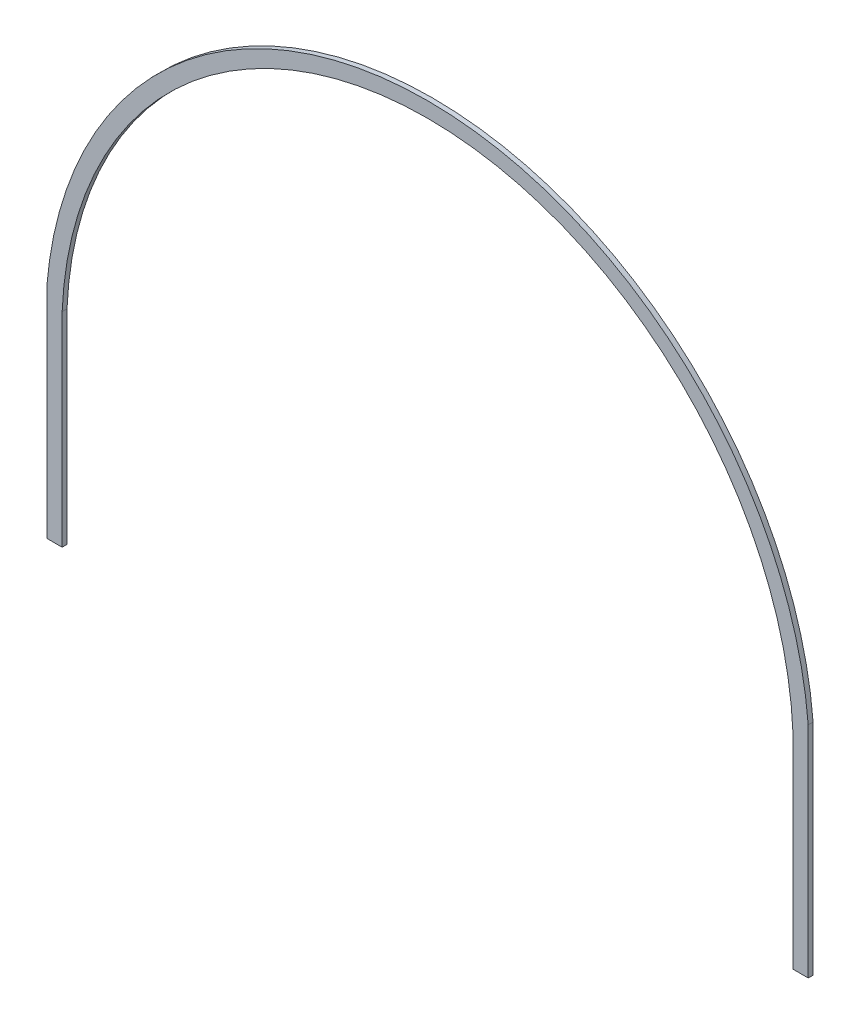
ISO-10303-21;
HEADER;
FILE_DESCRIPTION(('STEP AP214'),'2;1');
FILE_NAME('part.step','',(''),(''),'','','');
FILE_SCHEMA(('AUTOMOTIVE_DESIGN { 1 0 10303 214 1 1 1 1 }'));
ENDSEC;
DATA;
#1=APPLICATION_CONTEXT('core data for automotive mechanical design processes');
#2=APPLICATION_PROTOCOL_DEFINITION('international standard','automotive_design',2000,#1);
#3=PRODUCT_CONTEXT('',#1,'mechanical');
#4=PRODUCT('Part','Part','',(#3));
#5=PRODUCT_RELATED_PRODUCT_CATEGORY('part','',(#4));
#6=PRODUCT_DEFINITION_FORMATION('','',#4);
#7=PRODUCT_DEFINITION_CONTEXT('part definition',#1,'design');
#8=PRODUCT_DEFINITION('design','',#6,#7);
#9=PRODUCT_DEFINITION_SHAPE('','',#8);
#10=(LENGTH_UNIT() NAMED_UNIT(*) SI_UNIT(.MILLI.,.METRE.));
#11=(NAMED_UNIT(*) PLANE_ANGLE_UNIT() SI_UNIT($,.RADIAN.));
#12=(NAMED_UNIT(*) SI_UNIT($,.STERADIAN.) SOLID_ANGLE_UNIT());
#13=UNCERTAINTY_MEASURE_WITH_UNIT(LENGTH_MEASURE(1.E-05),#10,'distance_accuracy_value','');
#14=(GEOMETRIC_REPRESENTATION_CONTEXT(3) GLOBAL_UNCERTAINTY_ASSIGNED_CONTEXT((#13)) GLOBAL_UNIT_ASSIGNED_CONTEXT((#10,
#11,#12)) REPRESENTATION_CONTEXT('',''));
#15=CARTESIAN_POINT('',(0.,0.,0.));
#16=DIRECTION('',(0.,0.,1.));
#17=DIRECTION('',(1.,0.,0.));
#18=AXIS2_PLACEMENT_3D('',#15,#16,#17);
#19=CARTESIAN_POINT('',(0.,0.,1.6));
#20=DIRECTION('',(1.,0.,0.));
#21=DIRECTION('',(0.,0.,-1.));
#22=AXIS2_PLACEMENT_3D('',#19,#20,#21);
#23=PLANE('',#22);
#24=DIRECTION('',(0.,-1.,0.));
#25=VECTOR('',#24,1.);
#26=CARTESIAN_POINT('',(0.,0.,0.));
#27=LINE('',#26,#25);
#28=CARTESIAN_POINT('',(0.,72.,0.));
#29=VERTEX_POINT('',#28);
#30=CARTESIAN_POINT('',(0.,0.,0.));
#31=VERTEX_POINT('',#30);
#32=EDGE_CURVE('E142',#29,#31,#27,.T.);
#33=ORIENTED_EDGE('',*,*,#32,.T.);
#34=DIRECTION('',(0.,0.,-1.));
#35=VECTOR('',#34,1.);
#36=CARTESIAN_POINT('',(0.,0.,1.6));
#37=LINE('',#36,#35);
#38=CARTESIAN_POINT('',(0.,0.,1.6));
#39=VERTEX_POINT('',#38);
#40=EDGE_CURVE('E11',#39,#31,#37,.T.);
#41=ORIENTED_EDGE('',*,*,#40,.F.);
#42=DIRECTION('',(0.,-1.,0.));
#43=VECTOR('',#42,1.);
#44=CARTESIAN_POINT('',(0.,0.,1.6));
#45=LINE('',#44,#43);
#46=CARTESIAN_POINT('',(0.,72.,1.6));
#47=VERTEX_POINT('',#46);
#48=EDGE_CURVE('E164',#47,#39,#45,.T.);
#49=ORIENTED_EDGE('',*,*,#48,.F.);
#50=DIRECTION('',(0.,0.,-1.));
#51=VECTOR('',#50,1.);
#52=CARTESIAN_POINT('',(0.,72.,1.6));
#53=LINE('',#52,#51);
#54=EDGE_CURVE('E138',#47,#29,#53,.T.);
#55=ORIENTED_EDGE('',*,*,#54,.T.);
#56=EDGE_LOOP('',(#33,#41,#49,#55));
#57=FACE_BOUND('',#56,.T.);
#58=ADVANCED_FACE('F39',(#57),#23,.F.);
#59=CARTESIAN_POINT('',(0.,0.,1.6));
#60=DIRECTION('',(0.,1.,0.));
#61=DIRECTION('',(0.,0.,1.));
#62=AXIS2_PLACEMENT_3D('',#59,#60,#61);
#63=PLANE('',#62);
#64=DIRECTION('',(1.,0.,0.));
#65=VECTOR('',#64,1.);
#66=CARTESIAN_POINT('',(0.,0.,0.));
#67=LINE('',#66,#65);
#68=CARTESIAN_POINT('',(5.,0.,0.));
#69=VERTEX_POINT('',#68);
#70=EDGE_CURVE('E146',#31,#69,#67,.T.);
#71=ORIENTED_EDGE('',*,*,#70,.T.);
#72=DIRECTION('',(0.,0.,-1.));
#73=VECTOR('',#72,1.);
#74=CARTESIAN_POINT('',(5.,0.,1.6));
#75=LINE('',#74,#73);
#76=CARTESIAN_POINT('',(5.,0.,1.6));
#77=VERTEX_POINT('',#76);
#78=EDGE_CURVE('E48',#77,#69,#75,.T.);
#79=ORIENTED_EDGE('',*,*,#78,.F.);
#80=DIRECTION('',(1.,0.,0.));
#81=VECTOR('',#80,1.);
#82=CARTESIAN_POINT('',(0.,0.,1.6));
#83=LINE('',#82,#81);
#84=EDGE_CURVE('E99',#39,#77,#83,.T.);
#85=ORIENTED_EDGE('',*,*,#84,.F.);
#86=ORIENTED_EDGE('',*,*,#40,.T.);
#87=EDGE_LOOP('',(#71,#79,#85,#86));
#88=FACE_BOUND('',#87,.T.);
#89=ADVANCED_FACE('F216',(#88),#63,.F.);
#90=CARTESIAN_POINT('',(5.,0.,1.6));
#91=DIRECTION('',(-1.,0.,0.));
#92=DIRECTION('',(0.,-1.,0.));
#93=AXIS2_PLACEMENT_3D('',#90,#91,#92);
#94=PLANE('',#93);
#95=DIRECTION('',(0.,1.,0.));
#96=VECTOR('',#95,1.);
#97=CARTESIAN_POINT('',(5.,0.,0.));
#98=LINE('',#97,#96);
#99=CARTESIAN_POINT('',(5.,67.,0.));
#100=VERTEX_POINT('',#99);
#101=EDGE_CURVE('E149',#69,#100,#98,.T.);
#102=ORIENTED_EDGE('',*,*,#101,.T.);
#103=DIRECTION('',(0.,0.,-1.));
#104=VECTOR('',#103,1.);
#105=CARTESIAN_POINT('',(5.,67.,1.6));
#106=LINE('',#105,#104);
#107=CARTESIAN_POINT('',(5.,67.,1.6));
#108=VERTEX_POINT('',#107);
#109=EDGE_CURVE('E175',#108,#100,#106,.T.);
#110=ORIENTED_EDGE('',*,*,#109,.F.);
#111=DIRECTION('',(0.,1.,0.));
#112=VECTOR('',#111,1.);
#113=CARTESIAN_POINT('',(5.,0.,1.6));
#114=LINE('',#113,#112);
#115=EDGE_CURVE('E187',#77,#108,#114,.T.);
#116=ORIENTED_EDGE('',*,*,#115,.F.);
#117=ORIENTED_EDGE('',*,*,#78,.T.);
#118=EDGE_LOOP('',(#102,#110,#116,#117));
#119=FACE_BOUND('',#118,.T.);
#120=ADVANCED_FACE('F185',(#119),#94,.F.);
#121=CARTESIAN_POINT('',(125.,61.8913043478261,1.6));
#122=DIRECTION('',(0.,0.,-1.));
#123=DIRECTION('',(-1.,0.,0.));
#124=AXIS2_PLACEMENT_3D('',#121,#122,#123);
#125=CYLINDRICAL_SURFACE('',#124,120.108695652174);
#126=CARTESIAN_POINT('',(125.,61.8913043478261,0.));
#127=DIRECTION('',(0.,0.,-1.));
#128=DIRECTION('',(1.,0.,0.));
#129=AXIS2_PLACEMENT_3D('',#126,#127,#128);
#130=CIRCLE('',#129,120.108695652174);
#131=CARTESIAN_POINT('',(245.,67.,0.));
#132=VERTEX_POINT('',#131);
#133=EDGE_CURVE('E152',#100,#132,#130,.T.);
#134=ORIENTED_EDGE('',*,*,#133,.T.);
#135=DIRECTION('',(0.,0.,-1.));
#136=VECTOR('',#135,1.);
#137=CARTESIAN_POINT('',(245.,67.,1.6));
#138=LINE('',#137,#136);
#139=CARTESIAN_POINT('',(245.,67.,1.6));
#140=VERTEX_POINT('',#139);
#141=EDGE_CURVE('E171',#140,#132,#138,.T.);
#142=ORIENTED_EDGE('',*,*,#141,.F.);
#143=CARTESIAN_POINT('',(125.,61.8913043478261,1.6));
#144=DIRECTION('',(0.,0.,-1.));
#145=DIRECTION('',(1.,0.,0.));
#146=AXIS2_PLACEMENT_3D('',#143,#144,#145);
#147=CIRCLE('',#146,120.108695652174);
#148=EDGE_CURVE('E200',#108,#140,#147,.T.);
#149=ORIENTED_EDGE('',*,*,#148,.F.);
#150=ORIENTED_EDGE('',*,*,#109,.T.);
#151=EDGE_LOOP('',(#134,#142,#149,#150));
#152=FACE_BOUND('',#151,.T.);
#153=ADVANCED_FACE('F195',(#152),#125,.F.);
#154=CARTESIAN_POINT('',(245.,0.,1.6));
#155=DIRECTION('',(1.,0.,0.));
#156=DIRECTION('',(0.,0.,-1.));
#157=AXIS2_PLACEMENT_3D('',#154,#155,#156);
#158=PLANE('',#157);
#159=DIRECTION('',(0.,-1.,0.));
#160=VECTOR('',#159,1.);
#161=CARTESIAN_POINT('',(245.,0.,0.));
#162=LINE('',#161,#160);
#163=CARTESIAN_POINT('',(245.,0.,0.));
#164=VERTEX_POINT('',#163);
#165=EDGE_CURVE('E155',#132,#164,#162,.T.);
#166=ORIENTED_EDGE('',*,*,#165,.T.);
#167=DIRECTION('',(0.,0.,-1.));
#168=VECTOR('',#167,1.);
#169=CARTESIAN_POINT('',(245.,0.,1.6));
#170=LINE('',#169,#168);
#171=CARTESIAN_POINT('',(245.,0.,1.6));
#172=VERTEX_POINT('',#171);
#173=EDGE_CURVE('E129',#172,#164,#170,.T.);
#174=ORIENTED_EDGE('',*,*,#173,.F.);
#175=DIRECTION('',(0.,-1.,0.));
#176=VECTOR('',#175,1.);
#177=CARTESIAN_POINT('',(245.,0.,1.6));
#178=LINE('',#177,#176);
#179=EDGE_CURVE('E118',#140,#172,#178,.T.);
#180=ORIENTED_EDGE('',*,*,#179,.F.);
#181=ORIENTED_EDGE('',*,*,#141,.T.);
#182=EDGE_LOOP('',(#166,#174,#180,#181));
#183=FACE_BOUND('',#182,.T.);
#184=ADVANCED_FACE('F198',(#183),#158,.F.);
#185=CARTESIAN_POINT('',(250.,0.,1.6));
#186=DIRECTION('',(0.,1.,0.));
#187=DIRECTION('',(0.,0.,1.));
#188=AXIS2_PLACEMENT_3D('',#185,#186,#187);
#189=PLANE('',#188);
#190=DIRECTION('',(1.,0.,0.));
#191=VECTOR('',#190,1.);
#192=CARTESIAN_POINT('',(250.,0.,0.));
#193=LINE('',#192,#191);
#194=CARTESIAN_POINT('',(250.,0.,0.));
#195=VERTEX_POINT('',#194);
#196=EDGE_CURVE('E127',#164,#195,#193,.T.);
#197=ORIENTED_EDGE('',*,*,#196,.T.);
#198=DIRECTION('',(0.,0.,-1.));
#199=VECTOR('',#198,1.);
#200=CARTESIAN_POINT('',(250.,0.,1.6));
#201=LINE('',#200,#199);
#202=CARTESIAN_POINT('',(250.,0.,1.6));
#203=VERTEX_POINT('',#202);
#204=EDGE_CURVE('E124',#203,#195,#201,.T.);
#205=ORIENTED_EDGE('',*,*,#204,.F.);
#206=DIRECTION('',(1.,0.,0.));
#207=VECTOR('',#206,1.);
#208=CARTESIAN_POINT('',(250.,0.,1.6));
#209=LINE('',#208,#207);
#210=EDGE_CURVE('E112',#172,#203,#209,.T.);
#211=ORIENTED_EDGE('',*,*,#210,.F.);
#212=ORIENTED_EDGE('',*,*,#173,.T.);
#213=EDGE_LOOP('',(#197,#205,#211,#212));
#214=FACE_BOUND('',#213,.T.);
#215=ADVANCED_FACE('F125',(#214),#189,.F.);
#216=CARTESIAN_POINT('',(250.,0.,1.6));
#217=DIRECTION('',(-1.,0.,0.));
#218=DIRECTION('',(0.,0.,1.));
#219=AXIS2_PLACEMENT_3D('',#216,#217,#218);
#220=PLANE('',#219);
#221=DIRECTION('',(0.,1.,0.));
#222=VECTOR('',#221,1.);
#223=CARTESIAN_POINT('',(250.,0.,0.));
#224=LINE('',#223,#222);
#225=CARTESIAN_POINT('',(250.,72.,0.));
#226=VERTEX_POINT('',#225);
#227=EDGE_CURVE('E85',#195,#226,#224,.T.);
#228=ORIENTED_EDGE('',*,*,#227,.T.);
#229=DIRECTION('',(0.,0.,-1.));
#230=VECTOR('',#229,1.);
#231=CARTESIAN_POINT('',(250.,72.,1.6));
#232=LINE('',#231,#230);
#233=CARTESIAN_POINT('',(250.,72.,1.6));
#234=VERTEX_POINT('',#233);
#235=EDGE_CURVE('E130',#234,#226,#232,.T.);
#236=ORIENTED_EDGE('',*,*,#235,.F.);
#237=DIRECTION('',(0.,1.,0.));
#238=VECTOR('',#237,1.);
#239=CARTESIAN_POINT('',(250.,0.,1.6));
#240=LINE('',#239,#238);
#241=EDGE_CURVE('E116',#203,#234,#240,.T.);
#242=ORIENTED_EDGE('',*,*,#241,.F.);
#243=ORIENTED_EDGE('',*,*,#204,.T.);
#244=EDGE_LOOP('',(#228,#236,#242,#243));
#245=FACE_BOUND('',#244,.T.);
#246=ADVANCED_FACE('F132',(#245),#220,.F.);
#247=CARTESIAN_POINT('',(125.,61.5652173913044,1.6));
#248=DIRECTION('',(0.,0.,-1.));
#249=DIRECTION('',(-1.,0.,0.));
#250=AXIS2_PLACEMENT_3D('',#247,#248,#249);
#251=CYLINDRICAL_SURFACE('',#250,125.434782608696);
#252=CARTESIAN_POINT('',(125.,61.5652173913044,0.));
#253=DIRECTION('',(0.,0.,1.));
#254=DIRECTION('',(-1.,0.,0.));
#255=AXIS2_PLACEMENT_3D('',#252,#253,#254);
#256=CIRCLE('',#255,125.434782608696);
#257=EDGE_CURVE('E91',#226,#29,#256,.T.);
#258=ORIENTED_EDGE('',*,*,#257,.T.);
#259=ORIENTED_EDGE('',*,*,#54,.F.);
#260=CARTESIAN_POINT('',(125.,61.5652173913044,1.6));
#261=DIRECTION('',(0.,0.,1.));
#262=DIRECTION('',(-1.,0.,0.));
#263=AXIS2_PLACEMENT_3D('',#260,#261,#262);
#264=CIRCLE('',#263,125.434782608696);
#265=EDGE_CURVE('E56',#234,#47,#264,.T.);
#266=ORIENTED_EDGE('',*,*,#265,.F.);
#267=ORIENTED_EDGE('',*,*,#235,.T.);
#268=EDGE_LOOP('',(#258,#259,#266,#267));
#269=FACE_BOUND('',#268,.T.);
#270=ADVANCED_FACE('F232',(#269),#251,.T.);
#271=CARTESIAN_POINT('',(125.,61.5652173913044,1.6));
#272=DIRECTION('',(0.,0.,-1.));
#273=DIRECTION('',(-1.,0.,0.));
#274=AXIS2_PLACEMENT_3D('',#271,#272,#273);
#275=PLANE('',#274);
#276=ORIENTED_EDGE('',*,*,#48,.T.);
#277=ORIENTED_EDGE('',*,*,#84,.T.);
#278=ORIENTED_EDGE('',*,*,#115,.T.);
#279=ORIENTED_EDGE('',*,*,#148,.T.);
#280=ORIENTED_EDGE('',*,*,#179,.T.);
#281=ORIENTED_EDGE('',*,*,#210,.T.);
#282=ORIENTED_EDGE('',*,*,#241,.T.);
#283=ORIENTED_EDGE('',*,*,#265,.T.);
#284=EDGE_LOOP('',(#276,#277,#278,#279,#280,#281,#282,#283));
#285=FACE_BOUND('',#284,.T.);
#286=ADVANCED_FACE('F114',(#285),#275,.F.);
#287=CARTESIAN_POINT('',(125.,61.5652173913044,0.));
#288=DIRECTION('',(0.,0.,-1.));
#289=DIRECTION('',(-1.,0.,0.));
#290=AXIS2_PLACEMENT_3D('',#287,#288,#289);
#291=PLANE('',#290);
#292=ORIENTED_EDGE('',*,*,#32,.F.);
#293=ORIENTED_EDGE('',*,*,#257,.F.);
#294=ORIENTED_EDGE('',*,*,#227,.F.);
#295=ORIENTED_EDGE('',*,*,#196,.F.);
#296=ORIENTED_EDGE('',*,*,#165,.F.);
#297=ORIENTED_EDGE('',*,*,#133,.F.);
#298=ORIENTED_EDGE('',*,*,#101,.F.);
#299=ORIENTED_EDGE('',*,*,#70,.F.);
#300=EDGE_LOOP('',(#292,#293,#294,#295,#296,#297,#298,#299));
#301=FACE_BOUND('',#300,.T.);
#302=ADVANCED_FACE('F191',(#301),#291,.T.);
#303=CLOSED_SHELL('',(#58,#89,#120,#153,#184,#215,#246,#270,#286,#302));
#304=MANIFOLD_SOLID_BREP('B2',#303);
#305=ADVANCED_BREP_SHAPE_REPRESENTATION('',(#18,#304),#14);
#306=SHAPE_DEFINITION_REPRESENTATION(#9,#305);
ENDSEC;
END-ISO-10303-21;
